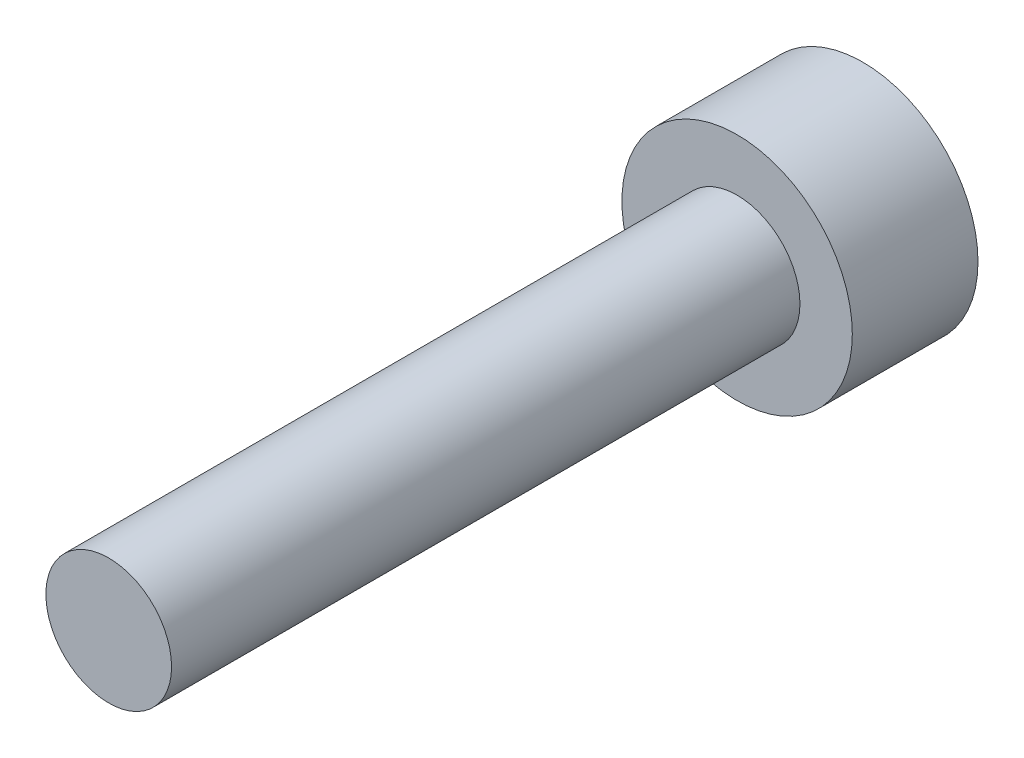
ISO-10303-21;
HEADER;
FILE_DESCRIPTION(('STEP AP214'),'2;1');
FILE_NAME('part.step','',(''),(''),'','','');
FILE_SCHEMA(('AUTOMOTIVE_DESIGN { 1 0 10303 214 1 1 1 1 }'));
ENDSEC;
DATA;
#1=APPLICATION_CONTEXT('core data for automotive mechanical design processes');
#2=APPLICATION_PROTOCOL_DEFINITION('international standard','automotive_design',2000,#1);
#3=PRODUCT_CONTEXT('',#1,'mechanical');
#4=PRODUCT('Part','Part','',(#3));
#5=PRODUCT_RELATED_PRODUCT_CATEGORY('part','',(#4));
#6=PRODUCT_DEFINITION_FORMATION('','',#4);
#7=PRODUCT_DEFINITION_CONTEXT('part definition',#1,'design');
#8=PRODUCT_DEFINITION('design','',#6,#7);
#9=PRODUCT_DEFINITION_SHAPE('','',#8);
#10=(LENGTH_UNIT() NAMED_UNIT(*) SI_UNIT(.MILLI.,.METRE.));
#11=(NAMED_UNIT(*) PLANE_ANGLE_UNIT() SI_UNIT($,.RADIAN.));
#12=(NAMED_UNIT(*) SI_UNIT($,.STERADIAN.) SOLID_ANGLE_UNIT());
#13=UNCERTAINTY_MEASURE_WITH_UNIT(LENGTH_MEASURE(1.E-05),#10,'distance_accuracy_value','');
#14=(GEOMETRIC_REPRESENTATION_CONTEXT(3) GLOBAL_UNCERTAINTY_ASSIGNED_CONTEXT((#13)) GLOBAL_UNIT_ASSIGNED_CONTEXT((#10,
#11,#12)) REPRESENTATION_CONTEXT('',''));
#15=CARTESIAN_POINT('',(0.,0.,0.));
#16=DIRECTION('',(0.,0.,1.));
#17=DIRECTION('',(1.,0.,0.));
#18=AXIS2_PLACEMENT_3D('',#15,#16,#17);
#19=CARTESIAN_POINT('',(0.,0.,3.));
#20=DIRECTION('',(0.,0.,-1.));
#21=DIRECTION('',(-1.,0.,0.));
#22=AXIS2_PLACEMENT_3D('',#19,#20,#21);
#23=CYLINDRICAL_SURFACE('',#22,2.75);
#24=CARTESIAN_POINT('',(0.,0.,3.));
#25=DIRECTION('',(0.,0.,1.));
#26=DIRECTION('',(1.,0.,0.));
#27=AXIS2_PLACEMENT_3D('',#24,#25,#26);
#28=CIRCLE('',#27,2.75);
#29=CARTESIAN_POINT('',(2.75,0.,3.));
#30=VERTEX_POINT('',#29);
#31=EDGE_CURVE('E39',#30,#30,#28,.T.);
#32=ORIENTED_EDGE('',*,*,#31,.F.);
#33=EDGE_LOOP('',(#32));
#34=FACE_BOUND('',#33,.T.);
#35=CARTESIAN_POINT('',(0.,0.,0.));
#36=DIRECTION('',(0.,0.,1.));
#37=DIRECTION('',(1.,0.,0.));
#38=AXIS2_PLACEMENT_3D('',#35,#36,#37);
#39=CIRCLE('',#38,2.75);
#40=CARTESIAN_POINT('',(2.75,0.,0.));
#41=VERTEX_POINT('',#40);
#42=EDGE_CURVE('E35',#41,#41,#39,.T.);
#43=ORIENTED_EDGE('',*,*,#42,.T.);
#44=EDGE_LOOP('',(#43));
#45=FACE_BOUND('',#44,.T.);
#46=ADVANCED_FACE('F32',(#34,#45),#23,.T.);
#47=CARTESIAN_POINT('',(0.,0.,3.));
#48=DIRECTION('',(0.,0.,1.));
#49=DIRECTION('',(1.,0.,0.));
#50=AXIS2_PLACEMENT_3D('',#47,#48,#49);
#51=PLANE('',#50);
#52=CARTESIAN_POINT('',(0.,0.,3.));
#53=DIRECTION('',(0.,0.,1.));
#54=DIRECTION('',(1.,0.,0.));
#55=AXIS2_PLACEMENT_3D('',#52,#53,#54);
#56=CIRCLE('',#55,1.5);
#57=CARTESIAN_POINT('',(1.5,0.,3.));
#58=VERTEX_POINT('',#57);
#59=EDGE_CURVE('E10',#58,#58,#56,.T.);
#60=ORIENTED_EDGE('',*,*,#59,.F.);
#61=EDGE_LOOP('',(#60));
#62=FACE_BOUND('',#61,.T.);
#63=ORIENTED_EDGE('',*,*,#31,.T.);
#64=EDGE_LOOP('',(#63));
#65=FACE_BOUND('',#64,.T.);
#66=ADVANCED_FACE('F56',(#62,#65),#51,.T.);
#67=CARTESIAN_POINT('',(0.,0.,0.));
#68=DIRECTION('',(0.,0.,1.));
#69=DIRECTION('',(1.,0.,0.));
#70=AXIS2_PLACEMENT_3D('',#67,#68,#69);
#71=PLANE('',#70);
#72=ORIENTED_EDGE('',*,*,#42,.F.);
#73=EDGE_LOOP('',(#72));
#74=FACE_BOUND('',#73,.T.);
#75=ADVANCED_FACE('F53',(#74),#71,.F.);
#76=CARTESIAN_POINT('',(0.,0.,18.));
#77=DIRECTION('',(0.,0.,-1.));
#78=DIRECTION('',(-1.,0.,0.));
#79=AXIS2_PLACEMENT_3D('',#76,#77,#78);
#80=CYLINDRICAL_SURFACE('',#79,1.5);
#81=CARTESIAN_POINT('',(0.,0.,18.));
#82=DIRECTION('',(0.,0.,1.));
#83=DIRECTION('',(1.,0.,0.));
#84=AXIS2_PLACEMENT_3D('',#81,#82,#83);
#85=CIRCLE('',#84,1.5);
#86=CARTESIAN_POINT('',(1.5,0.,18.));
#87=VERTEX_POINT('',#86);
#88=EDGE_CURVE('E45',#87,#87,#85,.T.);
#89=ORIENTED_EDGE('',*,*,#88,.F.);
#90=EDGE_LOOP('',(#89));
#91=FACE_BOUND('',#90,.T.);
#92=ORIENTED_EDGE('',*,*,#59,.T.);
#93=EDGE_LOOP('',(#92));
#94=FACE_BOUND('',#93,.T.);
#95=ADVANCED_FACE('F55',(#91,#94),#80,.T.);
#96=CARTESIAN_POINT('',(0.,0.,18.));
#97=DIRECTION('',(0.,0.,1.));
#98=DIRECTION('',(1.,0.,0.));
#99=AXIS2_PLACEMENT_3D('',#96,#97,#98);
#100=PLANE('',#99);
#101=ORIENTED_EDGE('',*,*,#88,.T.);
#102=EDGE_LOOP('',(#101));
#103=FACE_BOUND('',#102,.T.);
#104=ADVANCED_FACE('F61',(#103),#100,.T.);
#105=CLOSED_SHELL('',(#46,#66,#75,#95,#104));
#106=MANIFOLD_SOLID_BREP('B2',#105);
#107=ADVANCED_BREP_SHAPE_REPRESENTATION('',(#18,#106),#14);
#108=SHAPE_DEFINITION_REPRESENTATION(#9,#107);
ENDSEC;
END-ISO-10303-21;
